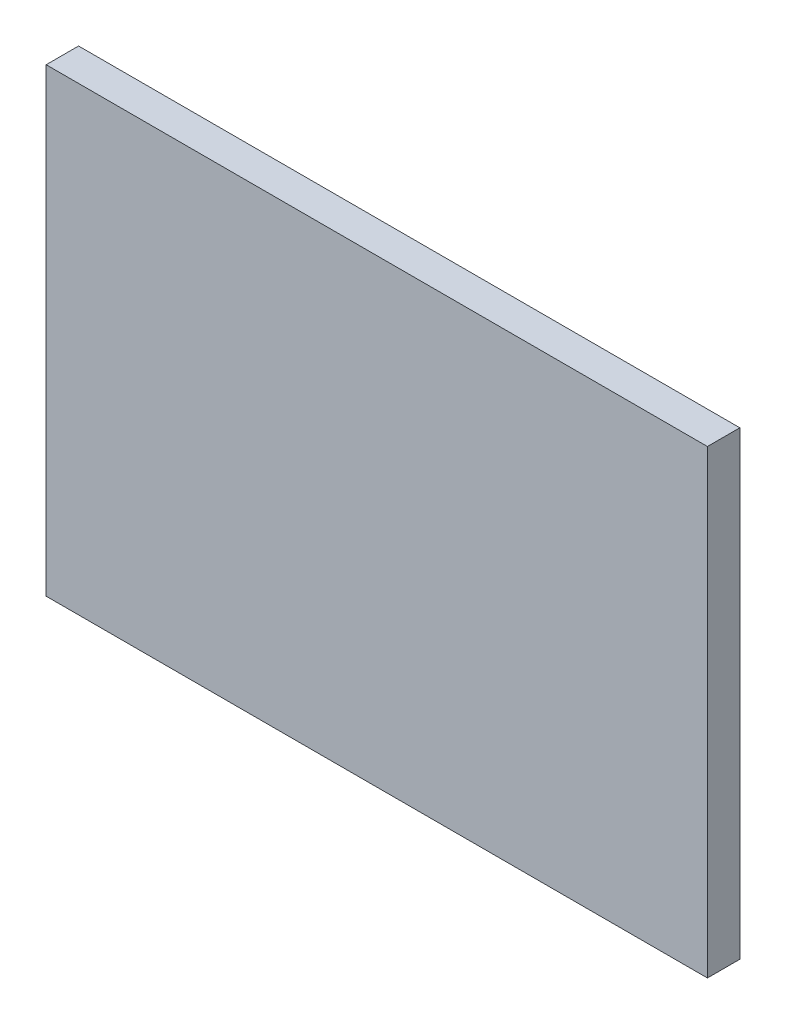
ISO-10303-21;
HEADER;
FILE_DESCRIPTION(('STEP AP214'),'2;1');
FILE_NAME('part.step','',(''),(''),'','','');
FILE_SCHEMA(('AUTOMOTIVE_DESIGN { 1 0 10303 214 1 1 1 1 }'));
ENDSEC;
DATA;
#1=APPLICATION_CONTEXT('core data for automotive mechanical design processes');
#2=APPLICATION_PROTOCOL_DEFINITION('international standard','automotive_design',2000,#1);
#3=PRODUCT_CONTEXT('',#1,'mechanical');
#4=PRODUCT('Part','Part','',(#3));
#5=PRODUCT_RELATED_PRODUCT_CATEGORY('part','',(#4));
#6=PRODUCT_DEFINITION_FORMATION('','',#4);
#7=PRODUCT_DEFINITION_CONTEXT('part definition',#1,'design');
#8=PRODUCT_DEFINITION('design','',#6,#7);
#9=PRODUCT_DEFINITION_SHAPE('','',#8);
#10=(LENGTH_UNIT() NAMED_UNIT(*) SI_UNIT(.MILLI.,.METRE.));
#11=(NAMED_UNIT(*) PLANE_ANGLE_UNIT() SI_UNIT($,.RADIAN.));
#12=(NAMED_UNIT(*) SI_UNIT($,.STERADIAN.) SOLID_ANGLE_UNIT());
#13=UNCERTAINTY_MEASURE_WITH_UNIT(LENGTH_MEASURE(1.E-05),#10,'distance_accuracy_value','');
#14=(GEOMETRIC_REPRESENTATION_CONTEXT(3) GLOBAL_UNCERTAINTY_ASSIGNED_CONTEXT((#13)) GLOBAL_UNIT_ASSIGNED_CONTEXT((#10,
#11,#12)) REPRESENTATION_CONTEXT('',''));
#15=CARTESIAN_POINT('',(0.,0.,0.));
#16=DIRECTION('',(0.,0.,1.));
#17=DIRECTION('',(1.,0.,0.));
#18=AXIS2_PLACEMENT_3D('',#15,#16,#17);
#19=CARTESIAN_POINT('',(-51.,35.5,5.));
#20=DIRECTION('',(1.,0.,0.));
#21=DIRECTION('',(0.,0.,-1.));
#22=AXIS2_PLACEMENT_3D('',#19,#20,#21);
#23=PLANE('',#22);
#24=DIRECTION('',(0.,-1.,0.));
#25=VECTOR('',#24,1.);
#26=CARTESIAN_POINT('',(-51.,35.5,0.));
#27=LINE('',#26,#25);
#28=CARTESIAN_POINT('',(-51.,35.5,0.));
#29=VERTEX_POINT('',#28);
#30=CARTESIAN_POINT('',(-51.,-35.5,0.));
#31=VERTEX_POINT('',#30);
#32=EDGE_CURVE('E96',#29,#31,#27,.T.);
#33=ORIENTED_EDGE('',*,*,#32,.T.);
#34=DIRECTION('',(0.,0.,-1.));
#35=VECTOR('',#34,1.);
#36=CARTESIAN_POINT('',(-51.,-35.5,5.));
#37=LINE('',#36,#35);
#38=CARTESIAN_POINT('',(-51.,-35.5,5.));
#39=VERTEX_POINT('',#38);
#40=EDGE_CURVE('E11',#39,#31,#37,.T.);
#41=ORIENTED_EDGE('',*,*,#40,.F.);
#42=DIRECTION('',(0.,-1.,0.));
#43=VECTOR('',#42,1.);
#44=CARTESIAN_POINT('',(-51.,35.5,5.));
#45=LINE('',#44,#43);
#46=CARTESIAN_POINT('',(-51.,35.5,5.));
#47=VERTEX_POINT('',#46);
#48=EDGE_CURVE('E84',#47,#39,#45,.T.);
#49=ORIENTED_EDGE('',*,*,#48,.F.);
#50=DIRECTION('',(0.,0.,-1.));
#51=VECTOR('',#50,1.);
#52=CARTESIAN_POINT('',(-51.,35.5,5.));
#53=LINE('',#52,#51);
#54=EDGE_CURVE('E92',#47,#29,#53,.T.);
#55=ORIENTED_EDGE('',*,*,#54,.T.);
#56=EDGE_LOOP('',(#33,#41,#49,#55));
#57=FACE_BOUND('',#56,.T.);
#58=ADVANCED_FACE('F33',(#57),#23,.F.);
#59=CARTESIAN_POINT('',(-51.,-35.5,5.));
#60=DIRECTION('',(0.,1.,0.));
#61=DIRECTION('',(-1.,0.,0.));
#62=AXIS2_PLACEMENT_3D('',#59,#60,#61);
#63=PLANE('',#62);
#64=DIRECTION('',(1.,0.,0.));
#65=VECTOR('',#64,1.);
#66=CARTESIAN_POINT('',(-51.,-35.5,0.));
#67=LINE('',#66,#65);
#68=CARTESIAN_POINT('',(51.,-35.5,0.));
#69=VERTEX_POINT('',#68);
#70=EDGE_CURVE('E88',#31,#69,#67,.T.);
#71=ORIENTED_EDGE('',*,*,#70,.T.);
#72=DIRECTION('',(0.,0.,-1.));
#73=VECTOR('',#72,1.);
#74=CARTESIAN_POINT('',(51.,-35.5,5.));
#75=LINE('',#74,#73);
#76=CARTESIAN_POINT('',(51.,-35.5,5.));
#77=VERTEX_POINT('',#76);
#78=EDGE_CURVE('E41',#77,#69,#75,.T.);
#79=ORIENTED_EDGE('',*,*,#78,.F.);
#80=DIRECTION('',(1.,0.,0.));
#81=VECTOR('',#80,1.);
#82=CARTESIAN_POINT('',(-51.,-35.5,5.));
#83=LINE('',#82,#81);
#84=EDGE_CURVE('E79',#39,#77,#83,.T.);
#85=ORIENTED_EDGE('',*,*,#84,.F.);
#86=ORIENTED_EDGE('',*,*,#40,.T.);
#87=EDGE_LOOP('',(#71,#79,#85,#86));
#88=FACE_BOUND('',#87,.T.);
#89=ADVANCED_FACE('F87',(#88),#63,.F.);
#90=CARTESIAN_POINT('',(51.,35.5,5.));
#91=DIRECTION('',(-1.,0.,0.));
#92=DIRECTION('',(0.,-1.,0.));
#93=AXIS2_PLACEMENT_3D('',#90,#91,#92);
#94=PLANE('',#93);
#95=DIRECTION('',(0.,1.,0.));
#96=VECTOR('',#95,1.);
#97=CARTESIAN_POINT('',(51.,35.5,0.));
#98=LINE('',#97,#96);
#99=CARTESIAN_POINT('',(51.,35.5,0.));
#100=VERTEX_POINT('',#99);
#101=EDGE_CURVE('E66',#69,#100,#98,.T.);
#102=ORIENTED_EDGE('',*,*,#101,.T.);
#103=DIRECTION('',(0.,0.,-1.));
#104=VECTOR('',#103,1.);
#105=CARTESIAN_POINT('',(51.,35.5,5.));
#106=LINE('',#105,#104);
#107=CARTESIAN_POINT('',(51.,35.5,5.));
#108=VERTEX_POINT('',#107);
#109=EDGE_CURVE('E89',#108,#100,#106,.T.);
#110=ORIENTED_EDGE('',*,*,#109,.F.);
#111=DIRECTION('',(0.,1.,0.));
#112=VECTOR('',#111,1.);
#113=CARTESIAN_POINT('',(51.,35.5,5.));
#114=LINE('',#113,#112);
#115=EDGE_CURVE('E82',#77,#108,#114,.T.);
#116=ORIENTED_EDGE('',*,*,#115,.F.);
#117=ORIENTED_EDGE('',*,*,#78,.T.);
#118=EDGE_LOOP('',(#102,#110,#116,#117));
#119=FACE_BOUND('',#118,.T.);
#120=ADVANCED_FACE('F90',(#119),#94,.F.);
#121=CARTESIAN_POINT('',(-51.,35.5,5.));
#122=DIRECTION('',(0.,-1.,0.));
#123=DIRECTION('',(0.,0.,-1.));
#124=AXIS2_PLACEMENT_3D('',#121,#122,#123);
#125=PLANE('',#124);
#126=DIRECTION('',(-1.,0.,0.));
#127=VECTOR('',#126,1.);
#128=CARTESIAN_POINT('',(-51.,35.5,0.));
#129=LINE('',#128,#127);
#130=EDGE_CURVE('E72',#100,#29,#129,.T.);
#131=ORIENTED_EDGE('',*,*,#130,.T.);
#132=ORIENTED_EDGE('',*,*,#54,.F.);
#133=DIRECTION('',(-1.,0.,0.));
#134=VECTOR('',#133,1.);
#135=CARTESIAN_POINT('',(-51.,35.5,5.));
#136=LINE('',#135,#134);
#137=EDGE_CURVE('E49',#108,#47,#136,.T.);
#138=ORIENTED_EDGE('',*,*,#137,.F.);
#139=ORIENTED_EDGE('',*,*,#109,.T.);
#140=EDGE_LOOP('',(#131,#132,#138,#139));
#141=FACE_BOUND('',#140,.T.);
#142=ADVANCED_FACE('F103',(#141),#125,.F.);
#143=CARTESIAN_POINT('',(0.,0.,5.));
#144=DIRECTION('',(0.,0.,1.));
#145=DIRECTION('',(1.,0.,0.));
#146=AXIS2_PLACEMENT_3D('',#143,#144,#145);
#147=PLANE('',#146);
#148=ORIENTED_EDGE('',*,*,#48,.T.);
#149=ORIENTED_EDGE('',*,*,#84,.T.);
#150=ORIENTED_EDGE('',*,*,#115,.T.);
#151=ORIENTED_EDGE('',*,*,#137,.T.);
#152=EDGE_LOOP('',(#148,#149,#150,#151));
#153=FACE_BOUND('',#152,.T.);
#154=ADVANCED_FACE('F80',(#153),#147,.T.);
#155=CARTESIAN_POINT('',(0.,0.,0.));
#156=DIRECTION('',(0.,0.,1.));
#157=DIRECTION('',(1.,0.,0.));
#158=AXIS2_PLACEMENT_3D('',#155,#156,#157);
#159=PLANE('',#158);
#160=ORIENTED_EDGE('',*,*,#32,.F.);
#161=ORIENTED_EDGE('',*,*,#130,.F.);
#162=ORIENTED_EDGE('',*,*,#101,.F.);
#163=ORIENTED_EDGE('',*,*,#70,.F.);
#164=EDGE_LOOP('',(#160,#161,#162,#163));
#165=FACE_BOUND('',#164,.T.);
#166=ADVANCED_FACE('F106',(#165),#159,.F.);
#167=CLOSED_SHELL('',(#58,#89,#120,#142,#154,#166));
#168=MANIFOLD_SOLID_BREP('B2',#167);
#169=ADVANCED_BREP_SHAPE_REPRESENTATION('',(#18,#168),#14);
#170=SHAPE_DEFINITION_REPRESENTATION(#9,#169);
ENDSEC;
END-ISO-10303-21;
